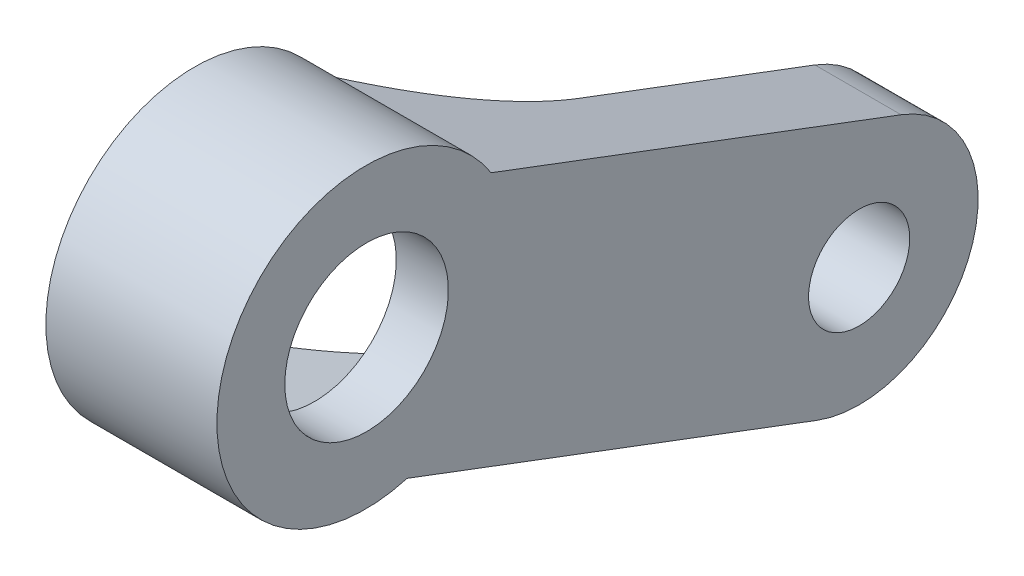
ISO-10303-21;
HEADER;
FILE_DESCRIPTION(('STEP AP214'),'2;1');
FILE_NAME('part.step','',(''),(''),'','','');
FILE_SCHEMA(('AUTOMOTIVE_DESIGN { 1 0 10303 214 1 1 1 1 }'));
ENDSEC;
DATA;
#1=APPLICATION_CONTEXT('core data for automotive mechanical design processes');
#2=APPLICATION_PROTOCOL_DEFINITION('international standard','automotive_design',2000,#1);
#3=PRODUCT_CONTEXT('',#1,'mechanical');
#4=PRODUCT('Part','Part','',(#3));
#5=PRODUCT_RELATED_PRODUCT_CATEGORY('part','',(#4));
#6=PRODUCT_DEFINITION_FORMATION('','',#4);
#7=PRODUCT_DEFINITION_CONTEXT('part definition',#1,'design');
#8=PRODUCT_DEFINITION('design','',#6,#7);
#9=PRODUCT_DEFINITION_SHAPE('','',#8);
#10=(LENGTH_UNIT() NAMED_UNIT(*) SI_UNIT(.MILLI.,.METRE.));
#11=(NAMED_UNIT(*) PLANE_ANGLE_UNIT() SI_UNIT($,.RADIAN.));
#12=(NAMED_UNIT(*) SI_UNIT($,.STERADIAN.) SOLID_ANGLE_UNIT());
#13=UNCERTAINTY_MEASURE_WITH_UNIT(LENGTH_MEASURE(1.E-05),#10,'distance_accuracy_value','');
#14=(GEOMETRIC_REPRESENTATION_CONTEXT(3) GLOBAL_UNCERTAINTY_ASSIGNED_CONTEXT((#13)) GLOBAL_UNIT_ASSIGNED_CONTEXT((#10,
#11,#12)) REPRESENTATION_CONTEXT('',''));
#15=CARTESIAN_POINT('',(0.,0.,0.));
#16=DIRECTION('',(0.,0.,1.));
#17=DIRECTION('',(1.,0.,0.));
#18=AXIS2_PLACEMENT_3D('',#15,#16,#17);
#19=CARTESIAN_POINT('',(38.55,-23.2949264743284,-61.5917656593506));
#20=DIRECTION('',(-1.,0.,0.));
#21=DIRECTION('',(0.,0.,1.));
#22=AXIS2_PLACEMENT_3D('',#19,#20,#21);
#23=CYLINDRICAL_SURFACE('',#22,2.75000000000001);
#24=CARTESIAN_POINT('',(44.3,-23.2949264743284,-61.5917656593506));
#25=DIRECTION('',(-1.,0.,0.));
#26=DIRECTION('',(0.,0.,1.));
#27=AXIS2_PLACEMENT_3D('',#24,#25,#26);
#28=CIRCLE('',#27,2.75000000000001);
#29=CARTESIAN_POINT('',(44.3,-23.2949264743284,-58.8417656593506));
#30=VERTEX_POINT('',#29);
#31=EDGE_CURVE('E175',#30,#30,#28,.T.);
#32=ORIENTED_EDGE('',*,*,#31,.F.);
#33=EDGE_LOOP('',(#32));
#34=FACE_BOUND('',#33,.T.);
#35=CARTESIAN_POINT('',(42.55,-23.2949264743284,-61.5917656593506));
#36=DIRECTION('',(-1.,0.,0.));
#37=DIRECTION('',(0.,0.,1.));
#38=AXIS2_PLACEMENT_3D('',#35,#36,#37);
#39=CIRCLE('',#38,2.75000000000001);
#40=CARTESIAN_POINT('',(42.55,-23.2949264743284,-58.8417656593506));
#41=VERTEX_POINT('',#40);
#42=EDGE_CURVE('E50',#41,#41,#39,.F.);
#43=ORIENTED_EDGE('',*,*,#42,.F.);
#44=EDGE_LOOP('',(#43));
#45=FACE_BOUND('',#44,.T.);
#46=ADVANCED_FACE('F45',(#34,#45),#23,.F.);
#47=CARTESIAN_POINT('',(41.4,-23.282719005727,-61.5594891228172));
#48=DIRECTION('',(-1.,0.,0.));
#49=DIRECTION('',(0.,0.,1.));
#50=AXIS2_PLACEMENT_3D('',#47,#48,#49);
#51=CYLINDRICAL_SURFACE('',#50,5.);
#52=CARTESIAN_POINT('',(38.55,-23.282719005727,-61.5594891228172));
#53=DIRECTION('',(-1.,0.,0.));
#54=DIRECTION('',(0.,0.,1.));
#55=AXIS2_PLACEMENT_3D('',#52,#53,#54);
#56=CIRCLE('',#55,5.);
#57=CARTESIAN_POINT('',(38.55,-28.0844507572134,-62.9535379694389));
#58=VERTEX_POINT('',#57);
#59=CARTESIAN_POINT('',(38.55,-20.5999472222424,-65.778817926992));
#60=VERTEX_POINT('',#59);
#61=EDGE_CURVE('E227',#58,#60,#56,.T.);
#62=ORIENTED_EDGE('',*,*,#61,.F.);
#63=DIRECTION('',(-1.,0.,0.));
#64=VECTOR('',#63,1.);
#65=CARTESIAN_POINT('',(58.442135623731,-28.0844507572134,-62.9535379694389));
#66=LINE('',#65,#64);
#67=CARTESIAN_POINT('',(44.3,-28.0844507572134,-62.9535379694389));
#68=VERTEX_POINT('',#67);
#69=EDGE_CURVE('E190',#68,#58,#66,.T.);
#70=ORIENTED_EDGE('',*,*,#69,.F.);
#71=CARTESIAN_POINT('',(44.3,-23.282719005727,-61.5594891228172));
#72=DIRECTION('',(-1.,0.,0.));
#73=DIRECTION('',(0.,0.,1.));
#74=AXIS2_PLACEMENT_3D('',#71,#72,#73);
#75=CIRCLE('',#74,5.);
#76=CARTESIAN_POINT('',(44.3,-20.5999472222424,-65.778817926992));
#77=VERTEX_POINT('',#76);
#78=EDGE_CURVE('E187',#77,#68,#75,.F.);
#79=ORIENTED_EDGE('',*,*,#78,.F.);
#80=DIRECTION('',(-1.,0.,0.));
#81=VECTOR('',#80,1.);
#82=CARTESIAN_POINT('',(58.442135623731,-20.5999472222424,-65.778817926992));
#83=LINE('',#82,#81);
#84=EDGE_CURVE('E193',#60,#77,#83,.F.);
#85=ORIENTED_EDGE('',*,*,#84,.F.);
#86=EDGE_LOOP('',(#62,#70,#79,#85));
#87=FACE_BOUND('',#86,.T.);
#88=ADVANCED_FACE('F268',(#87),#51,.T.);
#89=CARTESIAN_POINT('',(38.55,-23.282719005727,-61.5594891228172));
#90=DIRECTION('',(-1.,0.,0.));
#91=DIRECTION('',(0.,0.,1.));
#92=AXIS2_PLACEMENT_3D('',#89,#90,#91);
#93=PLANE('',#92);
#94=DIRECTION('',(0.,0.211437151055301,0.977391595602099));
#95=VECTOR('',#94,1.);
#96=CARTESIAN_POINT('',(38.55,-26.9112753780562,-60.809448200446));
#97=LINE('',#96,#95);
#98=CARTESIAN_POINT('',(38.55,-27.6139400441262,-64.0575932672692));
#99=VERTEX_POINT('',#98);
#100=CARTESIAN_POINT('',(38.55,-26.9112753780562,-60.809448200446));
#101=VERTEX_POINT('',#100);
#102=EDGE_CURVE('E153',#99,#101,#97,.T.);
#103=ORIENTED_EDGE('',*,*,#102,.F.);
#104=EDGE_CURVE('E233',#99,#58,#56,.T.);
#105=ORIENTED_EDGE('',*,*,#104,.T.);
#106=ORIENTED_EDGE('',*,*,#61,.T.);
#107=CARTESIAN_POINT('',(38.55,-21.6826509388195,-66.2965538449065));
#108=VERTEX_POINT('',#107);
#109=EDGE_CURVE('E228',#60,#108,#56,.T.);
#110=ORIENTED_EDGE('',*,*,#109,.T.);
#111=DIRECTION('',(0.,-0.487158588549977,-0.873313523084347));
#112=VECTOR('',#111,1.);
#113=CARTESIAN_POINT('',(38.55,-24.2279463818815,-70.8594230684324));
#114=LINE('',#113,#112);
#115=CARTESIAN_POINT('',(38.55,-20.0636664389163,-63.3942524369855));
#116=VERTEX_POINT('',#115);
#117=EDGE_CURVE('E63',#116,#108,#114,.T.);
#118=ORIENTED_EDGE('',*,*,#117,.F.);
#119=CARTESIAN_POINT('',(38.55,-23.2949264743284,-61.5917656593506));
#120=DIRECTION('',(-1.,0.,0.));
#121=DIRECTION('',(0.,0.,1.));
#122=AXIS2_PLACEMENT_3D('',#119,#120,#121);
#123=CIRCLE('',#122,3.70000000000001);
#124=EDGE_CURVE('E134',#101,#116,#123,.T.);
#125=ORIENTED_EDGE('',*,*,#124,.F.);
#126=EDGE_LOOP('',(#103,#105,#106,#110,#118,#125));
#127=FACE_BOUND('',#126,.T.);
#128=ADVANCED_FACE('F266',(#127),#93,.T.);
#129=CARTESIAN_POINT('',(41.4,-29.5449264743287,-78.1491340142255));
#130=DIRECTION('',(-1.,0.,0.));
#131=DIRECTION('',(0.,0.,1.));
#132=AXIS2_PLACEMENT_3D('',#129,#130,#131);
#133=PLANE('',#132);
#134=CARTESIAN_POINT('',(41.4,-29.5449264743287,-78.1491340142255));
#135=DIRECTION('',(-1.,0.,0.));
#136=DIRECTION('',(0.,0.,1.));
#137=AXIS2_PLACEMENT_3D('',#134,#135,#136);
#138=CIRCLE('',#137,1.70000000000001);
#139=CARTESIAN_POINT('',(41.4,-29.5449264743287,-76.4491340142255));
#140=VERTEX_POINT('',#139);
#141=EDGE_CURVE('E183',#140,#140,#138,.T.);
#142=ORIENTED_EDGE('',*,*,#141,.F.);
#143=EDGE_LOOP('',(#142));
#144=FACE_BOUND('',#143,.T.);
#145=DIRECTION('',(0.,-0.353153030771947,-0.935565570581019));
#146=VECTOR('',#145,1.);
#147=CARTESIAN_POINT('',(41.4,-33.2871887566527,-76.7365218911377));
#148=LINE('',#147,#146);
#149=CARTESIAN_POINT('',(41.4,-30.3027390072502,-68.8301804771426));
#150=VERTEX_POINT('',#149);
#151=CARTESIAN_POINT('',(41.4,-33.2871887566527,-76.7365218911377));
#152=VERTEX_POINT('',#151);
#153=EDGE_CURVE('E203',#150,#152,#148,.T.);
#154=ORIENTED_EDGE('',*,*,#153,.F.);
#155=CARTESIAN_POINT('',(41.4,-23.282719005727,-61.5594891228172));
#156=DIRECTION('',(-1.,0.,0.));
#157=DIRECTION('',(0.,0.,1.));
#158=AXIS2_PLACEMENT_3D('',#155,#156,#157);
#159=CIRCLE('',#158,10.1066133591648);
#160=CARTESIAN_POINT('',(41.4,-22.8182212399933,-71.6554227308238));
#161=VERTEX_POINT('',#160);
#162=EDGE_CURVE('E232',#150,#161,#159,.F.);
#163=ORIENTED_EDGE('',*,*,#162,.T.);
#164=DIRECTION('',(0.,0.353153030771945,0.93556557058102));
#165=VECTOR('',#164,1.);
#166=CARTESIAN_POINT('',(41.4,-19.5526641920044,-63.0043777824384));
#167=LINE('',#166,#165);
#168=CARTESIAN_POINT('',(41.4,-25.8026641920046,-79.5617461373133));
#169=VERTEX_POINT('',#168);
#170=EDGE_CURVE('E214',#169,#161,#167,.T.);
#171=ORIENTED_EDGE('',*,*,#170,.F.);
#172=CARTESIAN_POINT('',(41.4,-29.5449264743287,-78.1491340142255));
#173=DIRECTION('',(1.,0.,0.));
#174=DIRECTION('',(0.,0.,1.));
#175=AXIS2_PLACEMENT_3D('',#172,#173,#174);
#176=CIRCLE('',#175,3.99999999999998);
#177=EDGE_CURVE('E197',#152,#169,#176,.T.);
#178=ORIENTED_EDGE('',*,*,#177,.F.);
#179=EDGE_LOOP('',(#154,#163,#171,#178));
#180=FACE_BOUND('',#179,.T.);
#181=ADVANCED_FACE('F256',(#144,#180),#133,.T.);
#182=CARTESIAN_POINT('',(44.3,-29.5449264743287,-78.1491340142255));
#183=DIRECTION('',(-1.,0.,0.));
#184=DIRECTION('',(0.,0.,1.));
#185=AXIS2_PLACEMENT_3D('',#182,#183,#184);
#186=CYLINDRICAL_SURFACE('',#185,3.99999999999998);
#187=ORIENTED_EDGE('',*,*,#177,.T.);
#188=DIRECTION('',(-1.,0.,0.));
#189=VECTOR('',#188,1.);
#190=CARTESIAN_POINT('',(44.3,-25.8026641920046,-79.5617461373133));
#191=LINE('',#190,#189);
#192=CARTESIAN_POINT('',(44.3,-25.8026641920046,-79.5617461373133));
#193=VERTEX_POINT('',#192);
#194=EDGE_CURVE('E223',#193,#169,#191,.T.);
#195=ORIENTED_EDGE('',*,*,#194,.F.);
#196=CARTESIAN_POINT('',(44.3,-29.5449264743287,-78.1491340142255));
#197=DIRECTION('',(1.,0.,0.));
#198=DIRECTION('',(0.,0.,1.));
#199=AXIS2_PLACEMENT_3D('',#196,#197,#198);
#200=CIRCLE('',#199,3.99999999999998);
#201=CARTESIAN_POINT('',(44.3,-33.2871887566527,-76.7365218911377));
#202=VERTEX_POINT('',#201);
#203=EDGE_CURVE('E198',#202,#193,#200,.T.);
#204=ORIENTED_EDGE('',*,*,#203,.F.);
#205=DIRECTION('',(-1.,0.,0.));
#206=VECTOR('',#205,1.);
#207=CARTESIAN_POINT('',(44.3,-33.2871887566527,-76.7365218911377));
#208=LINE('',#207,#206);
#209=EDGE_CURVE('E210',#202,#152,#208,.T.);
#210=ORIENTED_EDGE('',*,*,#209,.T.);
#211=EDGE_LOOP('',(#187,#195,#204,#210));
#212=FACE_BOUND('',#211,.T.);
#213=ADVANCED_FACE('F261',(#212),#186,.T.);
#214=CARTESIAN_POINT('',(44.3,-19.5526641920044,-63.0043777824384));
#215=DIRECTION('',(0.,-0.93556557058102,0.353153030771945));
#216=DIRECTION('',(0.,-0.353153030771945,-0.93556557058102));
#217=AXIS2_PLACEMENT_3D('',#214,#215,#216);
#218=PLANE('',#217);
#219=ORIENTED_EDGE('',*,*,#170,.T.);
#220=CARTESIAN_POINT('',(41.4,-22.8182212399933,-71.6554227308238));
#221=CARTESIAN_POINT('',(41.40003272962,-22.7420055101409,-71.4535136246476));
#222=CARTESIAN_POINT('',(41.3901831828406,-22.6658154874938,-71.2516726214581));
#223=CARTESIAN_POINT('',(41.3516321429126,-22.5141038258614,-70.8497612829975));
#224=CARTESIAN_POINT('',(41.3229490918306,-22.4385816061968,-70.6496894094031));
#225=CARTESIAN_POINT('',(41.2479497450724,-22.28928753444,-70.254182699119));
#226=CARTESIAN_POINT('',(41.2017803436852,-22.2155063969343,-70.0587232637072));
#227=CARTESIAN_POINT('',(41.092840902476,-22.0694749027558,-69.6718597052231));
#228=CARTESIAN_POINT('',(41.0300657752802,-21.9972250225424,-69.4804568443767));
#229=CARTESIAN_POINT('',(40.8726872772205,-21.8380764745519,-69.0588438632214));
#230=CARTESIAN_POINT('',(40.7740782212513,-21.7516704572994,-68.829938862305));
#231=CARTESIAN_POINT('',(40.555687958511,-21.5822647690735,-68.3811528812861));
#232=CARTESIAN_POINT('',(40.4359018807762,-21.4992658872047,-68.1612739916632));
#233=CARTESIAN_POINT('',(40.1771360152517,-21.3367695747977,-67.73079218353));
#234=CARTESIAN_POINT('',(40.0380984032178,-21.2572836821703,-67.5202198310103));
#235=CARTESIAN_POINT('',(39.7434195379907,-21.1022431108132,-67.1094896150248));
#236=CARTESIAN_POINT('',(39.5877752491922,-21.0266891545871,-66.9093336656004));
#237=CARTESIAN_POINT('',(39.2881139193835,-20.8913120850591,-66.5506955844836));
#238=CARTESIAN_POINT('',(39.146204770409,-20.8309026323519,-66.3906601347895));
#239=CARTESIAN_POINT('',(38.8541413357792,-20.7131982723606,-66.0788402235333));
#240=CARTESIAN_POINT('',(38.704036006048,-20.655888234097,-65.9270156772992));
#241=CARTESIAN_POINT('',(38.55,-20.5999472222424,-65.778817926992));
#242=B_SPLINE_CURVE_WITH_KNOTS('',3,(#220,#221,#222,#223,#224,#225,#226,#227,#228,#229,#230,
#231,#232,#233,#234,#235,#236,#237,#238,#239,#240,#241),.UNSPECIFIED.,.F.,.F.,(4,2,2,2,2,2,2,2,
2,2,4),(0.,0.647112946399448,1.29359317263589,1.93475894040094,2.57612136535144,3.3663611010724,
4.15678283826384,4.949632391758,5.74262712271277,6.40908064034808,7.07191527078983),.UNSPECIFIED.);
#243=EDGE_CURVE('E243',#161,#60,#242,.T.);
#244=ORIENTED_EDGE('',*,*,#243,.T.);
#245=ORIENTED_EDGE('',*,*,#84,.T.);
#246=DIRECTION('',(0.,0.353153030771945,0.93556557058102));
#247=VECTOR('',#246,1.);
#248=CARTESIAN_POINT('',(44.3,-19.5526641920044,-63.0043777824384));
#249=LINE('',#248,#247);
#250=EDGE_CURVE('E202',#193,#77,#249,.T.);
#251=ORIENTED_EDGE('',*,*,#250,.F.);
#252=ORIENTED_EDGE('',*,*,#194,.T.);
#253=EDGE_LOOP('',(#219,#244,#245,#251,#252));
#254=FACE_BOUND('',#253,.T.);
#255=ADVANCED_FACE('F255',(#254),#218,.F.);
#256=CARTESIAN_POINT('',(44.3,-33.2871887566527,-76.7365218911377));
#257=DIRECTION('',(0.,0.935565570581019,-0.353153030771947));
#258=DIRECTION('',(0.,0.353153030771947,0.935565570581019));
#259=AXIS2_PLACEMENT_3D('',#256,#257,#258);
#260=PLANE('',#259);
#261=DIRECTION('',(0.,-0.353153030771947,-0.935565570581019));
#262=VECTOR('',#261,1.);
#263=CARTESIAN_POINT('',(44.3,-33.2871887566527,-76.7365218911377));
#264=LINE('',#263,#262);
#265=EDGE_CURVE('E207',#68,#202,#264,.T.);
#266=ORIENTED_EDGE('',*,*,#265,.F.);
#267=ORIENTED_EDGE('',*,*,#69,.T.);
#268=CARTESIAN_POINT('',(38.55,-28.0844507572134,-62.9535379694389));
#269=CARTESIAN_POINT('',(38.741872731002,-28.1541423338563,-63.1381634263521));
#270=CARTESIAN_POINT('',(38.9277058905416,-28.2259705307092,-63.3284491725218));
#271=CARTESIAN_POINT('',(39.2853828728042,-28.3740516330431,-63.7207425097599));
#272=CARTESIAN_POINT('',(39.4572021140983,-28.4503119279587,-63.9227696767628));
#273=CARTESIAN_POINT('',(39.7859607424365,-28.6079819608821,-64.3404658069449));
#274=CARTESIAN_POINT('',(39.9427275288594,-28.6894368629155,-64.5562544177094));
#275=CARTESIAN_POINT('',(40.2365573198655,-28.8566147462188,-64.9991385448518));
#276=CARTESIAN_POINT('',(40.3736339428955,-28.9423347218196,-65.2262260986748));
#277=CARTESIAN_POINT('',(40.6014134726531,-29.1010551589278,-65.6467049374983));
#278=CARTESIAN_POINT('',(40.6959753816563,-29.1733656929907,-65.8382684812449));
#279=CARTESIAN_POINT('',(40.8689740009444,-29.3203488196857,-66.2276530845474));
#280=CARTESIAN_POINT('',(40.9474142080053,-29.3950208960394,-66.4254727763894));
#281=CARTESIAN_POINT('',(41.0863978926429,-29.5459791102685,-66.825388097859));
#282=CARTESIAN_POINT('',(41.1470349092066,-29.6222544704296,-67.0274551753931));
#283=CARTESIAN_POINT('',(41.2496508868057,-29.7763263926818,-67.4356192665728));
#284=CARTESIAN_POINT('',(41.2916397083468,-29.8541221280778,-67.6417140901552));
#285=CARTESIAN_POINT('',(41.348848743915,-29.9936604649869,-68.011376113168));
#286=CARTESIAN_POINT('',(41.3679075021746,-30.0552087216792,-68.1744284583929));
#287=CARTESIAN_POINT('',(41.3935012727275,-30.1787452108603,-68.5016987234551));
#288=CARTESIAN_POINT('',(41.4000123977877,-30.240734057495,-68.6659182702751));
#289=CARTESIAN_POINT('',(41.4,-30.3027390072502,-68.8301804771426));
#290=B_SPLINE_CURVE_WITH_KNOTS('',3,(#268,#269,#270,#271,#272,#273,#274,#275,#276,#277,#278,
#279,#280,#281,#282,#283,#284,#285,#286,#287,#288,#289),.UNSPECIFIED.,.F.,.F.,(4,2,2,2,2,2,2,2,
2,2,4),(0.,0.825787229361996,1.6529931192437,2.48876904340531,3.3239641015554,3.9999625828065,
4.67581428577645,5.34804873040436,6.01992729681404,6.54545814763755,7.07198847976028),.UNSPECIFIED.);
#291=EDGE_CURVE('E71',#58,#150,#290,.T.);
#292=ORIENTED_EDGE('',*,*,#291,.T.);
#293=ORIENTED_EDGE('',*,*,#153,.T.);
#294=ORIENTED_EDGE('',*,*,#209,.F.);
#295=EDGE_LOOP('',(#266,#267,#292,#293,#294));
#296=FACE_BOUND('',#295,.T.);
#297=ADVANCED_FACE('F250',(#296),#260,.F.);
#298=CARTESIAN_POINT('',(44.3,-29.5449264743287,-78.1491340142255));
#299=DIRECTION('',(-1.,0.,0.));
#300=DIRECTION('',(0.,0.,1.));
#301=AXIS2_PLACEMENT_3D('',#298,#299,#300);
#302=PLANE('',#301);
#303=ORIENTED_EDGE('',*,*,#31,.T.);
#304=EDGE_LOOP('',(#303));
#305=FACE_BOUND('',#304,.T.);
#306=CARTESIAN_POINT('',(44.3,-29.5449264743287,-78.1491340142255));
#307=DIRECTION('',(1.,0.,0.));
#308=DIRECTION('',(0.,0.,-1.));
#309=AXIS2_PLACEMENT_3D('',#306,#307,#308);
#310=CIRCLE('',#309,1.70000000000001);
#311=CARTESIAN_POINT('',(44.3,-29.5449264743287,-79.8491340142255));
#312=VERTEX_POINT('',#311);
#313=EDGE_CURVE('E179',#312,#312,#310,.T.);
#314=ORIENTED_EDGE('',*,*,#313,.F.);
#315=EDGE_LOOP('',(#314));
#316=FACE_BOUND('',#315,.T.);
#317=ORIENTED_EDGE('',*,*,#250,.T.);
#318=ORIENTED_EDGE('',*,*,#78,.T.);
#319=ORIENTED_EDGE('',*,*,#265,.T.);
#320=ORIENTED_EDGE('',*,*,#203,.T.);
#321=EDGE_LOOP('',(#317,#318,#319,#320));
#322=FACE_BOUND('',#321,.T.);
#323=ADVANCED_FACE('F254',(#305,#316,#322),#302,.F.);
#324=CARTESIAN_POINT('',(44.3,-29.5449264743287,-78.1491340142255));
#325=DIRECTION('',(1.,0.,0.));
#326=DIRECTION('',(0.,0.,-1.));
#327=AXIS2_PLACEMENT_3D('',#324,#325,#326);
#328=CYLINDRICAL_SURFACE('',#327,1.70000000000001);
#329=ORIENTED_EDGE('',*,*,#141,.T.);
#330=EDGE_LOOP('',(#329));
#331=FACE_BOUND('',#330,.T.);
#332=ORIENTED_EDGE('',*,*,#313,.T.);
#333=EDGE_LOOP('',(#332));
#334=FACE_BOUND('',#333,.T.);
#335=ADVANCED_FACE('F297',(#331,#334),#328,.F.);
#336=CARTESIAN_POINT('',(35.4,-23.282719005727,-61.5594891228172));
#337=DIRECTION('',(-1.,0.,0.));
#338=DIRECTION('',(0.,0.,1.));
#339=AXIS2_PLACEMENT_3D('',#336,#337,#338);
#340=TOROIDAL_SURFACE('',#339,10.1066133591648,6.);
#341=ORIENTED_EDGE('',*,*,#104,.F.);
#342=CARTESIAN_POINT('',(38.5498,-27.6139011984781,-64.0574136989683));
#343=CARTESIAN_POINT('',(38.6507259837084,-27.6335082368104,-64.1480494003335));
#344=CARTESIAN_POINT('',(38.7496587940012,-27.6535729549072,-64.2408007769863));
#345=CARTESIAN_POINT('',(38.9433931124732,-27.6945771759386,-64.430347319873));
#346=CARTESIAN_POINT('',(39.0381944096572,-27.7155167234438,-64.5271426921392));
#347=CARTESIAN_POINT('',(39.2235954824082,-27.7582476249302,-64.7246710062354));
#348=CARTESIAN_POINT('',(39.3141913209551,-27.7800397432479,-64.8254074812958));
#349=CARTESIAN_POINT('',(39.4908645168994,-27.8244249733013,-65.0305831120046));
#350=CARTESIAN_POINT('',(39.5769419509337,-27.8470180714406,-65.1350222048023));
#351=CARTESIAN_POINT('',(39.8225722623085,-27.9144583179637,-65.4467721968358));
#352=CARTESIAN_POINT('',(39.9756382893737,-27.9603763269288,-65.6590332674437));
#353=CARTESIAN_POINT('',(40.2618790397959,-28.0548858613237,-66.0959140339539));
#354=CARTESIAN_POINT('',(40.3950607329417,-28.103476441762,-66.3205293615292));
#355=CARTESIAN_POINT('',(40.6237340715354,-28.1966998511392,-66.7514648730222));
#356=CARTESIAN_POINT('',(40.7218681624557,-28.2410427665741,-66.956444899731));
#357=CARTESIAN_POINT('',(40.8998776523483,-28.3313298071741,-67.3738067220683));
#358=CARTESIAN_POINT('',(40.9797579280214,-28.3772735008852,-67.5861865232528));
#359=CARTESIAN_POINT('',(41.1218794474836,-28.4718426668865,-68.0233429434537));
#360=CARTESIAN_POINT('',(41.1835423389884,-28.5205072718225,-68.2483004574493));
#361=CARTESIAN_POINT('',(41.2847144168714,-28.6189107362562,-68.7031813458627));
#362=CARTESIAN_POINT('',(41.3241980231018,-28.6686507677303,-68.9331101378704));
#363=CARTESIAN_POINT('',(41.3518547243172,-28.7187043862667,-69.1644885207271));
#364=B_SPLINE_CURVE_WITH_KNOTS('',3,(#342,#343,#344,#345,#346,#347,#348,#349,#350,#351,#352,
#353,#354,#355,#356,#357,#358,#359,#360,#361,#362,#363),.UNSPECIFIED.,.F.,.F.,(4,2,2,2,2,2,2,2,
2,2,4),(0.,0.411141693143375,0.822304358621972,1.23384448383229,1.64537762662212,
2.4413899117587,3.23712252300869,3.9309640645689,4.62462002169881,5.33838082150282,
6.05296314533257),.UNSPECIFIED.);
#365=CARTESIAN_POINT('',(41.3518307775471,-28.7186611206704,-69.1642885207271));
#366=VERTEX_POINT('',#365);
#367=EDGE_CURVE('E11',#99,#366,#364,.T.);
#368=ORIENTED_EDGE('',*,*,#367,.T.);
#369=CARTESIAN_POINT('',(41.3518377745576,-28.7188611206704,-69.1642130256379));
#370=CARTESIAN_POINT('',(41.3452544090364,-28.5317576653409,-69.2348399858375));
#371=CARTESIAN_POINT('',(41.3388315089359,-28.3446453061845,-69.3054703070131));
#372=CARTESIAN_POINT('',(41.3270659293241,-27.9703773686916,-69.4467472635436));
#373=CARTESIAN_POINT('',(41.3217233313842,-27.7832217881588,-69.5173938997275));
#374=CARTESIAN_POINT('',(41.312880720864,-27.4089486176256,-69.6586728316022));
#375=CARTESIAN_POINT('',(41.3093799376404,-27.2218310445344,-69.7293051209102));
#376=CARTESIAN_POINT('',(41.3046590767303,-26.8475769042891,-69.8705768693185));
#377=CARTESIAN_POINT('',(41.3034389122116,-26.6604403381296,-69.9412163280434));
#378=CARTESIAN_POINT('',(41.3034387324839,-26.2861672031544,-70.0824952464958));
#379=CARTESIAN_POINT('',(41.3046587172955,-26.0990306343389,-70.1531347062233));
#380=CARTESIAN_POINT('',(41.3093792417953,-25.7247764872196,-70.2944064572263));
#381=CARTESIAN_POINT('',(41.3128798683159,-25.5376589099103,-70.3650387481265));
#382=CARTESIAN_POINT('',(41.321722209651,-25.1633857309607,-70.5063176831782));
#383=CARTESIAN_POINT('',(41.3270646951248,-24.9762301462295,-70.5769643209469));
#384=CARTESIAN_POINT('',(41.3388301109152,-24.6019622013607,-70.7182412802616));
#385=CARTESIAN_POINT('',(41.3452529596571,-24.4148498390268,-70.7888716026366));
#386=CARTESIAN_POINT('',(41.3518363127529,-24.2277463818815,-70.8594985635216));
#387=B_SPLINE_CURVE_WITH_KNOTS('',3,(#369,#370,#371,#372,#373,#374,#375,#376,#377,#378,#379,
#380,#381,#382,#383,#384,#385,#386),.UNSPECIFIED.,.F.,.F.,(4,2,2,2,2,2,2,2,4),(0.,
0.600300859374017,1.20064702931793,1.80074180513565,2.40081373250235,3.00088566495993,
3.6009804456904,4.20132661972658,4.80162748391042),.UNSPECIFIED.);
#388=CARTESIAN_POINT('',(41.3518293157565,-24.2279463818815,-70.8594230684324));
#389=VERTEX_POINT('',#388);
#390=EDGE_CURVE('E56',#366,#389,#387,.T.);
#391=ORIENTED_EDGE('',*,*,#390,.T.);
#392=CARTESIAN_POINT('',(41.3518561164778,-24.2280579474478,-70.8596230684325));
#393=CARTESIAN_POINT('',(41.3287126318686,-24.1316116055648,-70.6867268153477));
#394=CARTESIAN_POINT('',(41.2973105616525,-24.0356600076936,-70.5147174739299));
#395=CARTESIAN_POINT('',(41.2188035432162,-23.8453543591278,-70.1735626625029));
#396=CARTESIAN_POINT('',(41.1717087305721,-23.7509993184807,-70.0044154178375));
#397=CARTESIAN_POINT('',(41.0628052105107,-23.5647224204716,-69.6704828178729));
#398=CARTESIAN_POINT('',(41.0010528911588,-23.472792702835,-69.5056833717124));
#399=CARTESIAN_POINT('',(40.8636131253052,-23.2914299657919,-69.1805602299553));
#400=CARTESIAN_POINT('',(40.7879233245643,-23.2019973711285,-69.0202372957819));
#401=CARTESIAN_POINT('',(40.6167925814792,-23.0188046504559,-68.691833601268));
#402=CARTESIAN_POINT('',(40.5202410900392,-22.9252908619115,-68.5241944421726));
#403=CARTESIAN_POINT('',(40.3130580756545,-22.7419995869725,-68.195614072597));
#404=CARTESIAN_POINT('',(40.2024203836684,-22.6522237606141,-68.0346758380105));
#405=CARTESIAN_POINT('',(39.9681806491385,-22.4766960857985,-67.7200130245143));
#406=CARTESIAN_POINT('',(39.8445692336028,-22.3909472122939,-67.5662937787063));
#407=CARTESIAN_POINT('',(39.5855744080799,-22.223827207094,-67.2667031239393));
#408=CARTESIAN_POINT('',(39.4501949087117,-22.1424546355617,-67.1208291338311));
#409=CARTESIAN_POINT('',(39.1901231343171,-21.9963964149272,-66.8589952624065));
#410=CARTESIAN_POINT('',(39.0669616406775,-21.9310616701824,-66.7418717682222));
#411=CARTESIAN_POINT('',(38.8136112454655,-21.8040663470264,-66.5142113395912));
#412=CARTESIAN_POINT('',(38.6834430334945,-21.7423959729127,-66.4036568447038));
#413=CARTESIAN_POINT('',(38.5498,-21.6825614383877,-66.2963934003629));
#414=B_SPLINE_CURVE_WITH_KNOTS('',3,(#392,#393,#394,#395,#396,#397,#398,#399,#400,#401,#402,
#403,#404,#405,#406,#407,#408,#409,#410,#411,#412,#413),.UNSPECIFIED.,.F.,.F.,(4,2,2,2,2,2,2,2,
2,2,4),(0.,0.597731672303267,1.19507802956884,1.79016258728451,2.38534775562029,
3.02932948744421,3.67359422703249,4.31832766833401,4.96284767316964,5.50882265642496,
6.05326556555354),.UNSPECIFIED.);
#415=EDGE_CURVE('E314',#389,#108,#414,.T.);
#416=ORIENTED_EDGE('',*,*,#415,.T.);
#417=ORIENTED_EDGE('',*,*,#109,.F.);
#418=ORIENTED_EDGE('',*,*,#243,.F.);
#419=ORIENTED_EDGE('',*,*,#162,.F.);
#420=ORIENTED_EDGE('',*,*,#291,.F.);
#421=EDGE_LOOP('',(#341,#368,#391,#416,#417,#418,#419,#420));
#422=FACE_BOUND('',#421,.T.);
#423=ADVANCED_FACE('F47',(#422),#340,.F.);
#424=CARTESIAN_POINT('',(42.55,-23.2949264743284,-61.5917656593506));
#425=DIRECTION('',(-1.,0.,0.));
#426=DIRECTION('',(0.,0.,1.));
#427=AXIS2_PLACEMENT_3D('',#424,#425,#426);
#428=PLANE('',#427);
#429=CARTESIAN_POINT('',(42.55,-23.2949264743284,-61.5917656593506));
#430=DIRECTION('',(-1.,0.,0.));
#431=DIRECTION('',(0.,0.,1.));
#432=AXIS2_PLACEMENT_3D('',#429,#430,#431);
#433=CIRCLE('',#432,3.70000000000001);
#434=CARTESIAN_POINT('',(42.55,-26.9112753780562,-60.809448200446));
#435=VERTEX_POINT('',#434);
#436=CARTESIAN_POINT('',(42.55,-20.0636664389163,-63.3942524369855));
#437=VERTEX_POINT('',#436);
#438=EDGE_CURVE('E131',#435,#437,#433,.T.);
#439=ORIENTED_EDGE('',*,*,#438,.T.);
#440=DIRECTION('',(0.,-0.487158588549977,-0.873313523084347));
#441=VECTOR('',#440,1.);
#442=CARTESIAN_POINT('',(42.55,-24.2279463818815,-70.8594230684324));
#443=LINE('',#442,#441);
#444=CARTESIAN_POINT('',(42.55,-24.2279463818815,-70.8594230684324));
#445=VERTEX_POINT('',#444);
#446=EDGE_CURVE('E140',#437,#445,#443,.T.);
#447=ORIENTED_EDGE('',*,*,#446,.T.);
#448=DIRECTION('',(0.,-0.935565570581018,0.353153030771949));
#449=VECTOR('',#448,1.);
#450=CARTESIAN_POINT('',(42.55,-28.7186611206704,-69.1642885207271));
#451=LINE('',#450,#449);
#452=CARTESIAN_POINT('',(42.55,-28.7186611206704,-69.1642885207271));
#453=VERTEX_POINT('',#452);
#454=EDGE_CURVE('E147',#445,#453,#451,.T.);
#455=ORIENTED_EDGE('',*,*,#454,.T.);
#456=DIRECTION('',(0.,0.211437151055301,0.977391595602099));
#457=VECTOR('',#456,1.);
#458=CARTESIAN_POINT('',(42.55,-26.9112753780562,-60.809448200446));
#459=LINE('',#458,#457);
#460=EDGE_CURVE('E137',#453,#435,#459,.T.);
#461=ORIENTED_EDGE('',*,*,#460,.T.);
#462=EDGE_LOOP('',(#439,#447,#455,#461));
#463=FACE_BOUND('',#462,.T.);
#464=ORIENTED_EDGE('',*,*,#42,.T.);
#465=EDGE_LOOP('',(#464));
#466=FACE_BOUND('',#465,.T.);
#467=ADVANCED_FACE('F149',(#463,#466),#428,.T.);
#468=CARTESIAN_POINT('',(42.55,-26.9112753780562,-60.809448200446));
#469=DIRECTION('',(0.,-0.977391595602099,0.211437151055301));
#470=DIRECTION('',(0.,-0.211437151055301,-0.977391595602099));
#471=AXIS2_PLACEMENT_3D('',#468,#469,#470);
#472=PLANE('',#471);
#473=ORIENTED_EDGE('',*,*,#102,.T.);
#474=DIRECTION('',(-1.,0.,0.));
#475=VECTOR('',#474,1.);
#476=CARTESIAN_POINT('',(42.55,-26.9112753780562,-60.809448200446));
#477=LINE('',#476,#475);
#478=EDGE_CURVE('E166',#435,#101,#477,.T.);
#479=ORIENTED_EDGE('',*,*,#478,.F.);
#480=ORIENTED_EDGE('',*,*,#460,.F.);
#481=DIRECTION('',(-1.,0.,0.));
#482=VECTOR('',#481,1.);
#483=CARTESIAN_POINT('',(42.55,-28.7186611206704,-69.1642885207271));
#484=LINE('',#483,#482);
#485=EDGE_CURVE('E169',#453,#366,#484,.T.);
#486=ORIENTED_EDGE('',*,*,#485,.T.);
#487=ORIENTED_EDGE('',*,*,#367,.F.);
#488=EDGE_LOOP('',(#473,#479,#480,#486,#487));
#489=FACE_BOUND('',#488,.T.);
#490=ADVANCED_FACE('F331',(#489),#472,.F.);
#491=CARTESIAN_POINT('',(42.55,-28.7186611206704,-69.1642885207271));
#492=DIRECTION('',(0.,-0.353153030771949,-0.935565570581018));
#493=DIRECTION('',(0.,0.935565570581018,-0.353153030771949));
#494=AXIS2_PLACEMENT_3D('',#491,#492,#493);
#495=PLANE('',#494);
#496=ORIENTED_EDGE('',*,*,#485,.F.);
#497=ORIENTED_EDGE('',*,*,#454,.F.);
#498=DIRECTION('',(-1.,0.,0.));
#499=VECTOR('',#498,1.);
#500=CARTESIAN_POINT('',(42.55,-24.2279463818815,-70.8594230684324));
#501=LINE('',#500,#499);
#502=EDGE_CURVE('E136',#445,#389,#501,.T.);
#503=ORIENTED_EDGE('',*,*,#502,.T.);
#504=ORIENTED_EDGE('',*,*,#390,.F.);
#505=EDGE_LOOP('',(#496,#497,#503,#504));
#506=FACE_BOUND('',#505,.T.);
#507=ADVANCED_FACE('F311',(#506),#495,.F.);
#508=CARTESIAN_POINT('',(42.55,-24.2279463818815,-70.8594230684324));
#509=DIRECTION('',(0.,0.873313523084347,-0.487158588549977));
#510=DIRECTION('',(0.,0.487158588549977,0.873313523084347));
#511=AXIS2_PLACEMENT_3D('',#508,#509,#510);
#512=PLANE('',#511);
#513=ORIENTED_EDGE('',*,*,#502,.F.);
#514=ORIENTED_EDGE('',*,*,#446,.F.);
#515=DIRECTION('',(-1.,0.,0.));
#516=VECTOR('',#515,1.);
#517=CARTESIAN_POINT('',(42.55,-20.0636664389163,-63.3942524369855));
#518=LINE('',#517,#516);
#519=EDGE_CURVE('E126',#437,#116,#518,.T.);
#520=ORIENTED_EDGE('',*,*,#519,.T.);
#521=ORIENTED_EDGE('',*,*,#117,.T.);
#522=ORIENTED_EDGE('',*,*,#415,.F.);
#523=EDGE_LOOP('',(#513,#514,#520,#521,#522));
#524=FACE_BOUND('',#523,.T.);
#525=ADVANCED_FACE('F141',(#524),#512,.F.);
#526=CARTESIAN_POINT('',(42.55,-23.2949264743284,-61.5917656593506));
#527=DIRECTION('',(-1.,0.,0.));
#528=DIRECTION('',(0.,0.,1.));
#529=AXIS2_PLACEMENT_3D('',#526,#527,#528);
#530=CYLINDRICAL_SURFACE('',#529,3.70000000000001);
#531=ORIENTED_EDGE('',*,*,#124,.T.);
#532=ORIENTED_EDGE('',*,*,#519,.F.);
#533=ORIENTED_EDGE('',*,*,#438,.F.);
#534=ORIENTED_EDGE('',*,*,#478,.T.);
#535=EDGE_LOOP('',(#531,#532,#533,#534));
#536=FACE_BOUND('',#535,.T.);
#537=ADVANCED_FACE('F128',(#536),#530,.F.);
#538=CLOSED_SHELL('',(#46,#88,#128,#181,#213,#255,#297,#323,#335,#423,#467,#490,#507,#525,#537));
#539=MANIFOLD_SOLID_BREP('B2',#538);
#540=ADVANCED_BREP_SHAPE_REPRESENTATION('',(#18,#539),#14);
#541=SHAPE_DEFINITION_REPRESENTATION(#9,#540);
ENDSEC;
END-ISO-10303-21;
